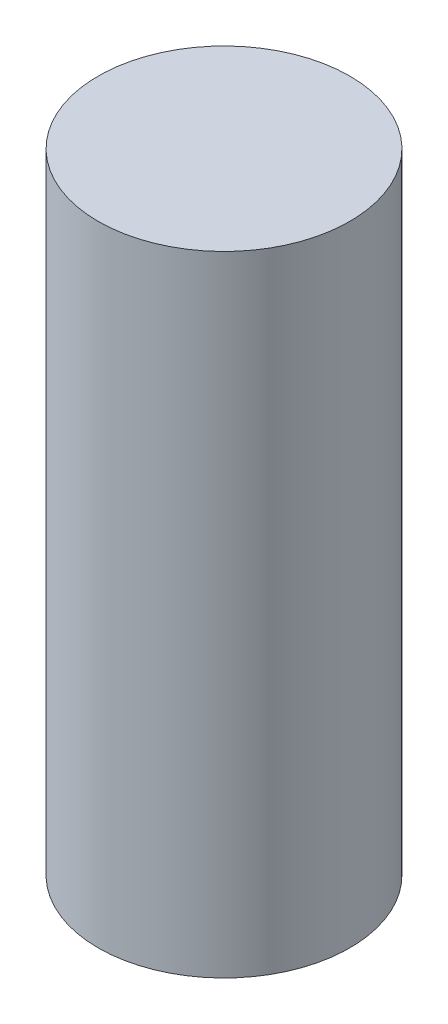
ISO-10303-21;
HEADER;
FILE_DESCRIPTION(('STEP AP214'),'2;1');
FILE_NAME('part.step','',(''),(''),'','','');
FILE_SCHEMA(('AUTOMOTIVE_DESIGN { 1 0 10303 214 1 1 1 1 }'));
ENDSEC;
DATA;
#1=APPLICATION_CONTEXT('core data for automotive mechanical design processes');
#2=APPLICATION_PROTOCOL_DEFINITION('international standard','automotive_design',2000,#1);
#3=PRODUCT_CONTEXT('',#1,'mechanical');
#4=PRODUCT('Part','Part','',(#3));
#5=PRODUCT_RELATED_PRODUCT_CATEGORY('part','',(#4));
#6=PRODUCT_DEFINITION_FORMATION('','',#4);
#7=PRODUCT_DEFINITION_CONTEXT('part definition',#1,'design');
#8=PRODUCT_DEFINITION('design','',#6,#7);
#9=PRODUCT_DEFINITION_SHAPE('','',#8);
#10=(LENGTH_UNIT() NAMED_UNIT(*) SI_UNIT(.MILLI.,.METRE.));
#11=(NAMED_UNIT(*) PLANE_ANGLE_UNIT() SI_UNIT($,.RADIAN.));
#12=(NAMED_UNIT(*) SI_UNIT($,.STERADIAN.) SOLID_ANGLE_UNIT());
#13=UNCERTAINTY_MEASURE_WITH_UNIT(LENGTH_MEASURE(1.E-05),#10,'distance_accuracy_value','');
#14=(GEOMETRIC_REPRESENTATION_CONTEXT(3) GLOBAL_UNCERTAINTY_ASSIGNED_CONTEXT((#13)) GLOBAL_UNIT_ASSIGNED_CONTEXT((#10,
#11,#12)) REPRESENTATION_CONTEXT('',''));
#15=CARTESIAN_POINT('',(0.,0.,0.));
#16=DIRECTION('',(0.,0.,1.));
#17=DIRECTION('',(1.,0.,0.));
#18=AXIS2_PLACEMENT_3D('',#15,#16,#17);
#19=CARTESIAN_POINT('',(0.,12.5,0.));
#20=DIRECTION('',(0.,-1.,0.));
#21=DIRECTION('',(0.,0.,-1.));
#22=AXIS2_PLACEMENT_3D('',#19,#20,#21);
#23=CYLINDRICAL_SURFACE('',#22,2.5);
#24=CARTESIAN_POINT('',(0.,12.5,0.));
#25=DIRECTION('',(0.,1.,0.));
#26=DIRECTION('',(0.,0.,1.));
#27=AXIS2_PLACEMENT_3D('',#24,#25,#26);
#28=CIRCLE('',#27,2.5);
#29=CARTESIAN_POINT('',(0.,12.5,2.5));
#30=VERTEX_POINT('',#29);
#31=EDGE_CURVE('E10',#30,#30,#28,.T.);
#32=ORIENTED_EDGE('',*,*,#31,.F.);
#33=EDGE_LOOP('',(#32));
#34=FACE_BOUND('',#33,.T.);
#35=CARTESIAN_POINT('',(0.,0.,0.));
#36=DIRECTION('',(0.,1.,0.));
#37=DIRECTION('',(0.,0.,1.));
#38=AXIS2_PLACEMENT_3D('',#35,#36,#37);
#39=CIRCLE('',#38,2.5);
#40=CARTESIAN_POINT('',(0.,0.,2.5));
#41=VERTEX_POINT('',#40);
#42=EDGE_CURVE('E40',#41,#41,#39,.T.);
#43=ORIENTED_EDGE('',*,*,#42,.T.);
#44=EDGE_LOOP('',(#43));
#45=FACE_BOUND('',#44,.T.);
#46=ADVANCED_FACE('F37',(#34,#45),#23,.T.);
#47=CARTESIAN_POINT('',(0.,12.5,0.));
#48=DIRECTION('',(0.,1.,0.));
#49=DIRECTION('',(0.,0.,1.));
#50=AXIS2_PLACEMENT_3D('',#47,#48,#49);
#51=PLANE('',#50);
#52=ORIENTED_EDGE('',*,*,#31,.T.);
#53=EDGE_LOOP('',(#52));
#54=FACE_BOUND('',#53,.T.);
#55=ADVANCED_FACE('F54',(#54),#51,.T.);
#56=CARTESIAN_POINT('',(0.,0.,0.));
#57=DIRECTION('',(0.,1.,0.));
#58=DIRECTION('',(0.,0.,1.));
#59=AXIS2_PLACEMENT_3D('',#56,#57,#58);
#60=PLANE('',#59);
#61=ORIENTED_EDGE('',*,*,#42,.F.);
#62=EDGE_LOOP('',(#61));
#63=FACE_BOUND('',#62,.T.);
#64=ADVANCED_FACE('F52',(#63),#60,.F.);
#65=CLOSED_SHELL('',(#46,#55,#64));
#66=MANIFOLD_SOLID_BREP('B2',#65);
#67=ADVANCED_BREP_SHAPE_REPRESENTATION('',(#18,#66),#14);
#68=SHAPE_DEFINITION_REPRESENTATION(#9,#67);
ENDSEC;
END-ISO-10303-21;
